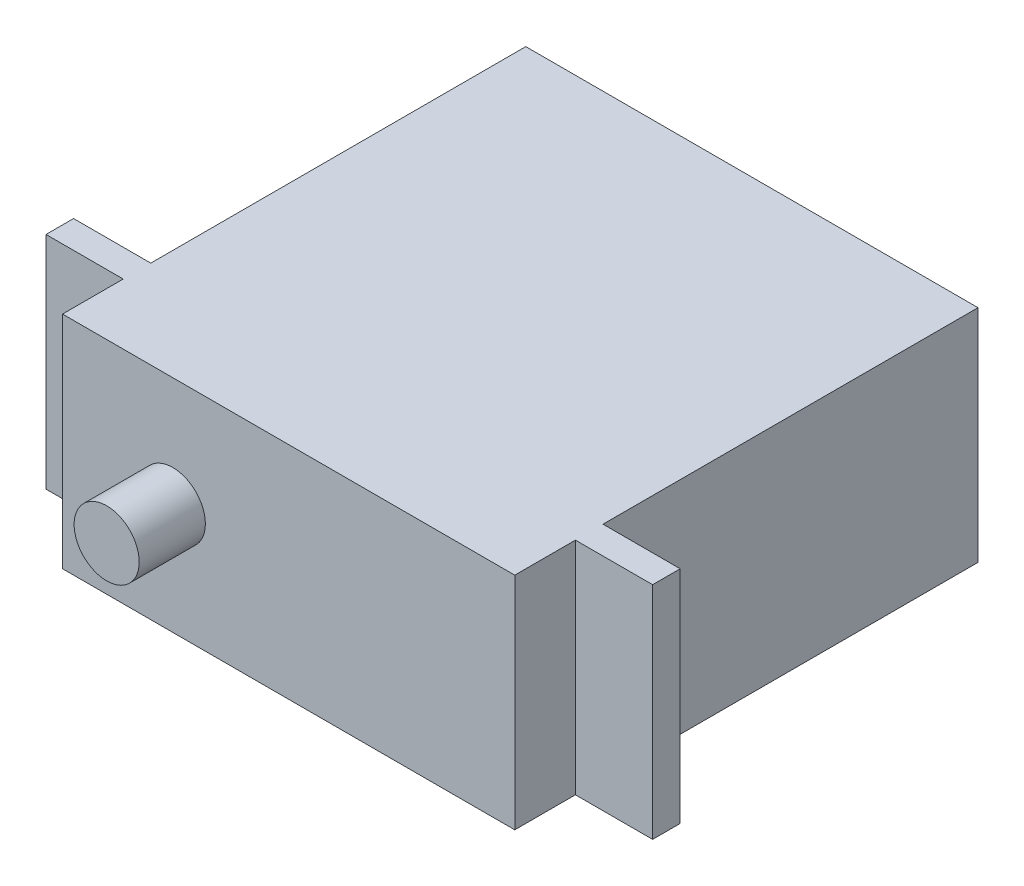
ISO-10303-21;
HEADER;
FILE_DESCRIPTION(('STEP AP214'),'2;1');
FILE_NAME('part.step','',(''),(''),'','','');
FILE_SCHEMA(('AUTOMOTIVE_DESIGN { 1 0 10303 214 1 1 1 1 }'));
ENDSEC;
DATA;
#1=APPLICATION_CONTEXT('core data for automotive mechanical design processes');
#2=APPLICATION_PROTOCOL_DEFINITION('international standard','automotive_design',2000,#1);
#3=PRODUCT_CONTEXT('',#1,'mechanical');
#4=PRODUCT('Part','Part','',(#3));
#5=PRODUCT_RELATED_PRODUCT_CATEGORY('part','',(#4));
#6=PRODUCT_DEFINITION_FORMATION('','',#4);
#7=PRODUCT_DEFINITION_CONTEXT('part definition',#1,'design');
#8=PRODUCT_DEFINITION('design','',#6,#7);
#9=PRODUCT_DEFINITION_SHAPE('','',#8);
#10=(LENGTH_UNIT() NAMED_UNIT(*) SI_UNIT(.MILLI.,.METRE.));
#11=(NAMED_UNIT(*) PLANE_ANGLE_UNIT() SI_UNIT($,.RADIAN.));
#12=(NAMED_UNIT(*) SI_UNIT($,.STERADIAN.) SOLID_ANGLE_UNIT());
#13=UNCERTAINTY_MEASURE_WITH_UNIT(LENGTH_MEASURE(1.E-05),#10,'distance_accuracy_value','');
#14=(GEOMETRIC_REPRESENTATION_CONTEXT(3) GLOBAL_UNCERTAINTY_ASSIGNED_CONTEXT((#13)) GLOBAL_UNIT_ASSIGNED_CONTEXT((#10,
#11,#12)) REPRESENTATION_CONTEXT('',''));
#15=CARTESIAN_POINT('',(0.,0.,0.));
#16=DIRECTION('',(0.,0.,1.));
#17=DIRECTION('',(1.,0.,0.));
#18=AXIS2_PLACEMENT_3D('',#15,#16,#17);
#19=CARTESIAN_POINT('',(-44.7515602948094,-3.43571428571428,42.));
#20=DIRECTION('',(1.,0.,0.));
#21=DIRECTION('',(0.,1.,0.));
#22=AXIS2_PLACEMENT_3D('',#19,#20,#21);
#23=PLANE('',#22);
#24=DIRECTION('',(0.,-1.,0.));
#25=VECTOR('',#24,1.);
#26=CARTESIAN_POINT('',(-44.7515602948094,-3.43571428571428,34.));
#27=LINE('',#26,#25);
#28=CARTESIAN_POINT('',(-44.7515602948094,-3.43571428571428,34.));
#29=VERTEX_POINT('',#28);
#30=CARTESIAN_POINT('',(-44.7515602948095,-23.4357142857143,34.));
#31=VERTEX_POINT('',#30);
#32=EDGE_CURVE('E47',#29,#31,#27,.T.);
#33=ORIENTED_EDGE('',*,*,#32,.F.);
#34=DIRECTION('',(0.,0.,-1.));
#35=VECTOR('',#34,1.);
#36=CARTESIAN_POINT('',(-44.7515602948094,-3.43571428571428,42.));
#37=LINE('',#36,#35);
#38=CARTESIAN_POINT('',(-44.7515602948094,-3.43571428571428,0.));
#39=VERTEX_POINT('',#38);
#40=EDGE_CURVE('E184',#29,#39,#37,.T.);
#41=ORIENTED_EDGE('',*,*,#40,.T.);
#42=DIRECTION('',(0.,-1.,0.));
#43=VECTOR('',#42,1.);
#44=CARTESIAN_POINT('',(-44.7515602948094,-3.43571428571428,0.));
#45=LINE('',#44,#43);
#46=CARTESIAN_POINT('',(-44.7515602948095,-23.4357142857143,0.));
#47=VERTEX_POINT('',#46);
#48=EDGE_CURVE('E173',#39,#47,#45,.T.);
#49=ORIENTED_EDGE('',*,*,#48,.T.);
#50=DIRECTION('',(0.,0.,-1.));
#51=VECTOR('',#50,1.);
#52=CARTESIAN_POINT('',(-44.7515602948095,-23.4357142857143,42.));
#53=LINE('',#52,#51);
#54=EDGE_CURVE('E40',#31,#47,#53,.T.);
#55=ORIENTED_EDGE('',*,*,#54,.F.);
#56=EDGE_LOOP('',(#33,#41,#49,#55));
#57=FACE_BOUND('',#56,.T.);
#58=ADVANCED_FACE('F33',(#57),#23,.F.);
#59=DIRECTION('',(0.,1.,0.));
#60=VECTOR('',#59,1.);
#61=CARTESIAN_POINT('',(-44.7515602948094,-3.43571428571428,36.5));
#62=LINE('',#61,#60);
#63=CARTESIAN_POINT('',(-44.7515602948095,-23.4357142857143,36.5));
#64=VERTEX_POINT('',#63);
#65=CARTESIAN_POINT('',(-44.7515602948094,-3.43571428571428,36.5));
#66=VERTEX_POINT('',#65);
#67=EDGE_CURVE('E138',#64,#66,#62,.T.);
#68=ORIENTED_EDGE('',*,*,#67,.F.);
#69=CARTESIAN_POINT('',(-44.7515602948095,-23.4357142857143,42.));
#70=VERTEX_POINT('',#69);
#71=EDGE_CURVE('E11',#70,#64,#53,.T.);
#72=ORIENTED_EDGE('',*,*,#71,.F.);
#73=DIRECTION('',(0.,-1.,0.));
#74=VECTOR('',#73,1.);
#75=CARTESIAN_POINT('',(-44.7515602948094,-3.43571428571428,42.));
#76=LINE('',#75,#74);
#77=CARTESIAN_POINT('',(-44.7515602948094,-3.43571428571428,42.));
#78=VERTEX_POINT('',#77);
#79=EDGE_CURVE('E174',#78,#70,#76,.T.);
#80=ORIENTED_EDGE('',*,*,#79,.F.);
#81=EDGE_CURVE('E193',#78,#66,#37,.T.);
#82=ORIENTED_EDGE('',*,*,#81,.T.);
#83=EDGE_LOOP('',(#68,#72,#80,#82));
#84=FACE_BOUND('',#83,.T.);
#85=ADVANCED_FACE('F269',(#84),#23,.F.);
#86=CARTESIAN_POINT('',(-3.75156029480944,-3.43571428571428,42.));
#87=DIRECTION('',(-1.,0.,0.));
#88=DIRECTION('',(0.,0.,1.));
#89=AXIS2_PLACEMENT_3D('',#86,#87,#88);
#90=PLANE('',#89);
#91=DIRECTION('',(0.,-1.,0.));
#92=VECTOR('',#91,1.);
#93=CARTESIAN_POINT('',(-3.75156029480944,-3.43571428571428,36.5));
#94=LINE('',#93,#92);
#95=CARTESIAN_POINT('',(-3.75156029480944,-3.43571428571428,36.5));
#96=VERTEX_POINT('',#95);
#97=CARTESIAN_POINT('',(-3.75156029480944,-23.4357142857143,36.5));
#98=VERTEX_POINT('',#97);
#99=EDGE_CURVE('E141',#96,#98,#94,.T.);
#100=ORIENTED_EDGE('',*,*,#99,.F.);
#101=DIRECTION('',(0.,0.,-1.));
#102=VECTOR('',#101,1.);
#103=CARTESIAN_POINT('',(-3.75156029480944,-3.43571428571428,42.));
#104=LINE('',#103,#102);
#105=CARTESIAN_POINT('',(-3.75156029480944,-3.43571428571428,42.));
#106=VERTEX_POINT('',#105);
#107=EDGE_CURVE('E196',#106,#96,#104,.T.);
#108=ORIENTED_EDGE('',*,*,#107,.F.);
#109=DIRECTION('',(0.,1.,0.));
#110=VECTOR('',#109,1.);
#111=CARTESIAN_POINT('',(-3.75156029480944,-3.43571428571428,42.));
#112=LINE('',#111,#110);
#113=CARTESIAN_POINT('',(-3.75156029480944,-23.4357142857143,42.));
#114=VERTEX_POINT('',#113);
#115=EDGE_CURVE('E180',#114,#106,#112,.T.);
#116=ORIENTED_EDGE('',*,*,#115,.F.);
#117=DIRECTION('',(0.,0.,-1.));
#118=VECTOR('',#117,1.);
#119=CARTESIAN_POINT('',(-3.75156029480944,-23.4357142857143,42.));
#120=LINE('',#119,#118);
#121=EDGE_CURVE('E199',#114,#98,#120,.T.);
#122=ORIENTED_EDGE('',*,*,#121,.T.);
#123=EDGE_LOOP('',(#100,#108,#116,#122));
#124=FACE_BOUND('',#123,.T.);
#125=ADVANCED_FACE('F228',(#124),#90,.F.);
#126=DIRECTION('',(0.,1.,0.));
#127=VECTOR('',#126,1.);
#128=CARTESIAN_POINT('',(-3.75156029480944,-3.43571428571428,34.));
#129=LINE('',#128,#127);
#130=CARTESIAN_POINT('',(-3.75156029480944,-23.4357142857143,34.));
#131=VERTEX_POINT('',#130);
#132=CARTESIAN_POINT('',(-3.75156029480944,-3.43571428571428,34.));
#133=VERTEX_POINT('',#132);
#134=EDGE_CURVE('E144',#131,#133,#129,.T.);
#135=ORIENTED_EDGE('',*,*,#134,.F.);
#136=CARTESIAN_POINT('',(-3.75156029480944,-23.4357142857143,0.));
#137=VERTEX_POINT('',#136);
#138=EDGE_CURVE('E198',#131,#137,#120,.T.);
#139=ORIENTED_EDGE('',*,*,#138,.T.);
#140=DIRECTION('',(0.,1.,0.));
#141=VECTOR('',#140,1.);
#142=CARTESIAN_POINT('',(-3.75156029480944,-3.43571428571428,0.));
#143=LINE('',#142,#141);
#144=CARTESIAN_POINT('',(-3.75156029480944,-3.43571428571428,0.));
#145=VERTEX_POINT('',#144);
#146=EDGE_CURVE('E188',#137,#145,#143,.T.);
#147=ORIENTED_EDGE('',*,*,#146,.T.);
#148=EDGE_CURVE('E195',#133,#145,#104,.T.);
#149=ORIENTED_EDGE('',*,*,#148,.F.);
#150=EDGE_LOOP('',(#135,#139,#147,#149));
#151=FACE_BOUND('',#150,.T.);
#152=ADVANCED_FACE('F205',(#151),#90,.F.);
#153=CARTESIAN_POINT('',(-44.7515602948095,-23.4357142857143,42.));
#154=DIRECTION('',(0.,1.,0.));
#155=DIRECTION('',(0.,0.,1.));
#156=AXIS2_PLACEMENT_3D('',#153,#154,#155);
#157=PLANE('',#156);
#158=DIRECTION('',(1.,0.,0.));
#159=VECTOR('',#158,1.);
#160=CARTESIAN_POINT('',(-44.7515602948095,-23.4357142857143,0.));
#161=LINE('',#160,#159);
#162=EDGE_CURVE('E186',#47,#137,#161,.T.);
#163=ORIENTED_EDGE('',*,*,#162,.T.);
#164=ORIENTED_EDGE('',*,*,#138,.F.);
#165=DIRECTION('',(-1.,0.,0.));
#166=VECTOR('',#165,1.);
#167=CARTESIAN_POINT('',(3.24843970519056,-23.4357142857143,34.));
#168=LINE('',#167,#166);
#169=CARTESIAN_POINT('',(3.24843970519056,-23.4357142857143,34.));
#170=VERTEX_POINT('',#169);
#171=EDGE_CURVE('E167',#170,#131,#168,.T.);
#172=ORIENTED_EDGE('',*,*,#171,.F.);
#173=DIRECTION('',(0.,0.,-1.));
#174=VECTOR('',#173,1.);
#175=CARTESIAN_POINT('',(3.24843970519056,-23.4357142857143,36.5));
#176=LINE('',#175,#174);
#177=CARTESIAN_POINT('',(3.24843970519056,-23.4357142857143,36.5));
#178=VERTEX_POINT('',#177);
#179=EDGE_CURVE('E153',#178,#170,#176,.T.);
#180=ORIENTED_EDGE('',*,*,#179,.F.);
#181=DIRECTION('',(-1.,0.,0.));
#182=VECTOR('',#181,1.);
#183=CARTESIAN_POINT('',(3.24843970519056,-23.4357142857143,36.5));
#184=LINE('',#183,#182);
#185=EDGE_CURVE('E170',#178,#98,#184,.T.);
#186=ORIENTED_EDGE('',*,*,#185,.T.);
#187=ORIENTED_EDGE('',*,*,#121,.F.);
#188=DIRECTION('',(1.,0.,0.));
#189=VECTOR('',#188,1.);
#190=CARTESIAN_POINT('',(-44.7515602948095,-23.4357142857143,42.));
#191=LINE('',#190,#189);
#192=EDGE_CURVE('E177',#70,#114,#191,.T.);
#193=ORIENTED_EDGE('',*,*,#192,.F.);
#194=ORIENTED_EDGE('',*,*,#71,.T.);
#195=DIRECTION('',(1.,0.,0.));
#196=VECTOR('',#195,1.);
#197=CARTESIAN_POINT('',(-51.7515602948095,-23.4357142857143,36.5));
#198=LINE('',#197,#196);
#199=CARTESIAN_POINT('',(-51.7515602948095,-23.4357142857143,36.5));
#200=VERTEX_POINT('',#199);
#201=EDGE_CURVE('E125',#200,#64,#198,.T.);
#202=ORIENTED_EDGE('',*,*,#201,.F.);
#203=DIRECTION('',(0.,0.,1.));
#204=VECTOR('',#203,1.);
#205=CARTESIAN_POINT('',(-51.7515602948095,-23.4357142857143,34.));
#206=LINE('',#205,#204);
#207=CARTESIAN_POINT('',(-51.7515602948095,-23.4357142857143,34.));
#208=VERTEX_POINT('',#207);
#209=EDGE_CURVE('E118',#208,#200,#206,.T.);
#210=ORIENTED_EDGE('',*,*,#209,.F.);
#211=DIRECTION('',(1.,0.,0.));
#212=VECTOR('',#211,1.);
#213=CARTESIAN_POINT('',(-51.7515602948095,-23.4357142857143,34.));
#214=LINE('',#213,#212);
#215=EDGE_CURVE('E123',#208,#31,#214,.T.);
#216=ORIENTED_EDGE('',*,*,#215,.T.);
#217=ORIENTED_EDGE('',*,*,#54,.T.);
#218=EDGE_LOOP('',(#163,#164,#172,#180,#186,#187,#193,#194,#202,#210,#216,#217));
#219=FACE_BOUND('',#218,.T.);
#220=ADVANCED_FACE('F121',(#219),#157,.F.);
#221=CARTESIAN_POINT('',(-44.7515602948094,-3.43571428571428,42.));
#222=DIRECTION('',(0.,-1.,0.));
#223=DIRECTION('',(0.,0.,-1.));
#224=AXIS2_PLACEMENT_3D('',#221,#222,#223);
#225=PLANE('',#224);
#226=DIRECTION('',(-1.,0.,0.));
#227=VECTOR('',#226,1.);
#228=CARTESIAN_POINT('',(-44.7515602948094,-3.43571428571428,0.));
#229=LINE('',#228,#227);
#230=EDGE_CURVE('E178',#145,#39,#229,.T.);
#231=ORIENTED_EDGE('',*,*,#230,.T.);
#232=ORIENTED_EDGE('',*,*,#40,.F.);
#233=DIRECTION('',(1.,0.,0.));
#234=VECTOR('',#233,1.);
#235=CARTESIAN_POINT('',(-51.7515602948094,-3.43571428571428,34.));
#236=LINE('',#235,#234);
#237=CARTESIAN_POINT('',(-51.7515602948094,-3.43571428571428,34.));
#238=VERTEX_POINT('',#237);
#239=EDGE_CURVE('E242',#238,#29,#236,.T.);
#240=ORIENTED_EDGE('',*,*,#239,.F.);
#241=DIRECTION('',(0.,0.,-1.));
#242=VECTOR('',#241,1.);
#243=CARTESIAN_POINT('',(-51.7515602948094,-3.43571428571428,34.));
#244=LINE('',#243,#242);
#245=CARTESIAN_POINT('',(-51.7515602948094,-3.43571428571428,36.5));
#246=VERTEX_POINT('',#245);
#247=EDGE_CURVE('E134',#246,#238,#244,.T.);
#248=ORIENTED_EDGE('',*,*,#247,.F.);
#249=DIRECTION('',(1.,0.,0.));
#250=VECTOR('',#249,1.);
#251=CARTESIAN_POINT('',(-51.7515602948094,-3.43571428571428,36.5));
#252=LINE('',#251,#250);
#253=EDGE_CURVE('E146',#246,#66,#252,.T.);
#254=ORIENTED_EDGE('',*,*,#253,.T.);
#255=ORIENTED_EDGE('',*,*,#81,.F.);
#256=DIRECTION('',(-1.,0.,0.));
#257=VECTOR('',#256,1.);
#258=CARTESIAN_POINT('',(-44.7515602948094,-3.43571428571428,42.));
#259=LINE('',#258,#257);
#260=EDGE_CURVE('E182',#106,#78,#259,.T.);
#261=ORIENTED_EDGE('',*,*,#260,.F.);
#262=ORIENTED_EDGE('',*,*,#107,.T.);
#263=DIRECTION('',(-1.,0.,0.));
#264=VECTOR('',#263,1.);
#265=CARTESIAN_POINT('',(3.24843970519056,-3.43571428571428,36.5));
#266=LINE('',#265,#264);
#267=CARTESIAN_POINT('',(3.24843970519056,-3.43571428571428,36.5));
#268=VERTEX_POINT('',#267);
#269=EDGE_CURVE('E158',#268,#96,#266,.T.);
#270=ORIENTED_EDGE('',*,*,#269,.F.);
#271=DIRECTION('',(0.,0.,1.));
#272=VECTOR('',#271,1.);
#273=CARTESIAN_POINT('',(3.24843970519056,-3.43571428571428,36.5));
#274=LINE('',#273,#272);
#275=CARTESIAN_POINT('',(3.24843970519056,-3.43571428571428,34.));
#276=VERTEX_POINT('',#275);
#277=EDGE_CURVE('E157',#276,#268,#274,.T.);
#278=ORIENTED_EDGE('',*,*,#277,.F.);
#279=DIRECTION('',(-1.,0.,0.));
#280=VECTOR('',#279,1.);
#281=CARTESIAN_POINT('',(3.24843970519056,-3.43571428571428,34.));
#282=LINE('',#281,#280);
#283=EDGE_CURVE('E164',#276,#133,#282,.T.);
#284=ORIENTED_EDGE('',*,*,#283,.T.);
#285=ORIENTED_EDGE('',*,*,#148,.T.);
#286=EDGE_LOOP('',(#231,#232,#240,#248,#254,#255,#261,#262,#270,#278,#284,#285));
#287=FACE_BOUND('',#286,.T.);
#288=ADVANCED_FACE('F214',(#287),#225,.F.);
#289=CARTESIAN_POINT('',(0.,0.,42.));
#290=DIRECTION('',(0.,0.,1.));
#291=DIRECTION('',(1.,0.,0.));
#292=AXIS2_PLACEMENT_3D('',#289,#290,#291);
#293=PLANE('',#292);
#294=CARTESIAN_POINT('',(-34.7515602948094,-13.4357142857143,42.));
#295=DIRECTION('',(0.,0.,1.));
#296=DIRECTION('',(1.,0.,0.));
#297=AXIS2_PLACEMENT_3D('',#294,#295,#296);
#298=CIRCLE('',#297,2.95);
#299=CARTESIAN_POINT('',(-31.8015602948094,-13.4357142857143,42.));
#300=VERTEX_POINT('',#299);
#301=EDGE_CURVE('E249',#300,#300,#298,.T.);
#302=ORIENTED_EDGE('',*,*,#301,.F.);
#303=EDGE_LOOP('',(#302));
#304=FACE_BOUND('',#303,.T.);
#305=ORIENTED_EDGE('',*,*,#79,.T.);
#306=ORIENTED_EDGE('',*,*,#192,.T.);
#307=ORIENTED_EDGE('',*,*,#115,.T.);
#308=ORIENTED_EDGE('',*,*,#260,.T.);
#309=EDGE_LOOP('',(#305,#306,#307,#308));
#310=FACE_BOUND('',#309,.T.);
#311=ADVANCED_FACE('F234',(#304,#310),#293,.T.);
#312=CARTESIAN_POINT('',(0.,0.,0.));
#313=DIRECTION('',(0.,0.,1.));
#314=DIRECTION('',(1.,0.,0.));
#315=AXIS2_PLACEMENT_3D('',#312,#313,#314);
#316=PLANE('',#315);
#317=ORIENTED_EDGE('',*,*,#48,.F.);
#318=ORIENTED_EDGE('',*,*,#230,.F.);
#319=ORIENTED_EDGE('',*,*,#146,.F.);
#320=ORIENTED_EDGE('',*,*,#162,.F.);
#321=EDGE_LOOP('',(#317,#318,#319,#320));
#322=FACE_BOUND('',#321,.T.);
#323=ADVANCED_FACE('F212',(#322),#316,.F.);
#324=CARTESIAN_POINT('',(3.24843970519056,-3.43571428571428,36.5));
#325=DIRECTION('',(0.,0.,-1.));
#326=DIRECTION('',(-1.,0.,0.));
#327=AXIS2_PLACEMENT_3D('',#324,#325,#326);
#328=PLANE('',#327);
#329=ORIENTED_EDGE('',*,*,#99,.T.);
#330=ORIENTED_EDGE('',*,*,#185,.F.);
#331=DIRECTION('',(0.,-1.,0.));
#332=VECTOR('',#331,1.);
#333=CARTESIAN_POINT('',(3.24843970519056,-3.43571428571428,36.5));
#334=LINE('',#333,#332);
#335=EDGE_CURVE('E150',#268,#178,#334,.T.);
#336=ORIENTED_EDGE('',*,*,#335,.F.);
#337=ORIENTED_EDGE('',*,*,#269,.T.);
#338=EDGE_LOOP('',(#329,#330,#336,#337));
#339=FACE_BOUND('',#338,.T.);
#340=ADVANCED_FACE('F226',(#339),#328,.F.);
#341=CARTESIAN_POINT('',(3.24843970519056,-3.43571428571428,34.));
#342=DIRECTION('',(0.,0.,1.));
#343=DIRECTION('',(1.,0.,0.));
#344=AXIS2_PLACEMENT_3D('',#341,#342,#343);
#345=PLANE('',#344);
#346=ORIENTED_EDGE('',*,*,#134,.T.);
#347=ORIENTED_EDGE('',*,*,#283,.F.);
#348=DIRECTION('',(0.,1.,0.));
#349=VECTOR('',#348,1.);
#350=CARTESIAN_POINT('',(3.24843970519056,-3.43571428571428,34.));
#351=LINE('',#350,#349);
#352=EDGE_CURVE('E155',#170,#276,#351,.T.);
#353=ORIENTED_EDGE('',*,*,#352,.F.);
#354=ORIENTED_EDGE('',*,*,#171,.T.);
#355=EDGE_LOOP('',(#346,#347,#353,#354));
#356=FACE_BOUND('',#355,.T.);
#357=ADVANCED_FACE('F218',(#356),#345,.F.);
#358=CARTESIAN_POINT('',(3.24843970519056,0.,0.));
#359=DIRECTION('',(1.,0.,0.));
#360=DIRECTION('',(0.,0.,-1.));
#361=AXIS2_PLACEMENT_3D('',#358,#359,#360);
#362=PLANE('',#361);
#363=ORIENTED_EDGE('',*,*,#335,.T.);
#364=ORIENTED_EDGE('',*,*,#179,.T.);
#365=ORIENTED_EDGE('',*,*,#352,.T.);
#366=ORIENTED_EDGE('',*,*,#277,.T.);
#367=EDGE_LOOP('',(#363,#364,#365,#366));
#368=FACE_BOUND('',#367,.T.);
#369=ADVANCED_FACE('F223',(#368),#362,.T.);
#370=CARTESIAN_POINT('',(-51.7515602948094,-3.43571428571428,34.));
#371=DIRECTION('',(0.,0.,1.));
#372=DIRECTION('',(1.,0.,0.));
#373=AXIS2_PLACEMENT_3D('',#370,#371,#372);
#374=PLANE('',#373);
#375=ORIENTED_EDGE('',*,*,#32,.T.);
#376=ORIENTED_EDGE('',*,*,#215,.F.);
#377=DIRECTION('',(0.,-1.,0.));
#378=VECTOR('',#377,1.);
#379=CARTESIAN_POINT('',(-51.7515602948094,-3.43571428571428,34.));
#380=LINE('',#379,#378);
#381=EDGE_CURVE('E129',#238,#208,#380,.T.);
#382=ORIENTED_EDGE('',*,*,#381,.F.);
#383=ORIENTED_EDGE('',*,*,#239,.T.);
#384=EDGE_LOOP('',(#375,#376,#382,#383));
#385=FACE_BOUND('',#384,.T.);
#386=ADVANCED_FACE('F140',(#385),#374,.F.);
#387=CARTESIAN_POINT('',(-51.7515602948094,-3.43571428571428,36.5));
#388=DIRECTION('',(0.,0.,-1.));
#389=DIRECTION('',(-1.,0.,0.));
#390=AXIS2_PLACEMENT_3D('',#387,#388,#389);
#391=PLANE('',#390);
#392=ORIENTED_EDGE('',*,*,#67,.T.);
#393=ORIENTED_EDGE('',*,*,#253,.F.);
#394=DIRECTION('',(0.,1.,0.));
#395=VECTOR('',#394,1.);
#396=CARTESIAN_POINT('',(-51.7515602948094,-3.43571428571428,36.5));
#397=LINE('',#396,#395);
#398=EDGE_CURVE('E128',#200,#246,#397,.T.);
#399=ORIENTED_EDGE('',*,*,#398,.F.);
#400=ORIENTED_EDGE('',*,*,#201,.T.);
#401=EDGE_LOOP('',(#392,#393,#399,#400));
#402=FACE_BOUND('',#401,.T.);
#403=ADVANCED_FACE('F239',(#402),#391,.F.);
#404=CARTESIAN_POINT('',(-51.7515602948094,0.,0.));
#405=DIRECTION('',(-1.,0.,0.));
#406=DIRECTION('',(0.,-1.,0.));
#407=AXIS2_PLACEMENT_3D('',#404,#405,#406);
#408=PLANE('',#407);
#409=ORIENTED_EDGE('',*,*,#381,.T.);
#410=ORIENTED_EDGE('',*,*,#209,.T.);
#411=ORIENTED_EDGE('',*,*,#398,.T.);
#412=ORIENTED_EDGE('',*,*,#247,.T.);
#413=EDGE_LOOP('',(#409,#410,#411,#412));
#414=FACE_BOUND('',#413,.T.);
#415=ADVANCED_FACE('F132',(#414),#408,.T.);
#416=CARTESIAN_POINT('',(-34.7515602948094,-13.4357142857143,48.));
#417=DIRECTION('',(0.,0.,-1.));
#418=DIRECTION('',(-1.,0.,0.));
#419=AXIS2_PLACEMENT_3D('',#416,#417,#418);
#420=CYLINDRICAL_SURFACE('',#419,2.95);
#421=CARTESIAN_POINT('',(-34.7515602948094,-13.4357142857143,48.));
#422=DIRECTION('',(0.,0.,1.));
#423=DIRECTION('',(1.,0.,0.));
#424=AXIS2_PLACEMENT_3D('',#421,#422,#423);
#425=CIRCLE('',#424,2.95);
#426=CARTESIAN_POINT('',(-31.8015602948094,-13.4357142857143,48.));
#427=VERTEX_POINT('',#426);
#428=EDGE_CURVE('E246',#427,#427,#425,.T.);
#429=ORIENTED_EDGE('',*,*,#428,.F.);
#430=EDGE_LOOP('',(#429));
#431=FACE_BOUND('',#430,.T.);
#432=ORIENTED_EDGE('',*,*,#301,.T.);
#433=EDGE_LOOP('',(#432));
#434=FACE_BOUND('',#433,.T.);
#435=ADVANCED_FACE('F257',(#431,#434),#420,.T.);
#436=CARTESIAN_POINT('',(-34.7515602948094,-13.4357142857143,48.));
#437=DIRECTION('',(0.,0.,1.));
#438=DIRECTION('',(1.,0.,0.));
#439=AXIS2_PLACEMENT_3D('',#436,#437,#438);
#440=PLANE('',#439);
#441=ORIENTED_EDGE('',*,*,#428,.T.);
#442=EDGE_LOOP('',(#441));
#443=FACE_BOUND('',#442,.T.);
#444=ADVANCED_FACE('F330',(#443),#440,.T.);
#445=CLOSED_SHELL('',(#58,#85,#125,#152,#220,#288,#311,#323,#340,#357,#369,#386,#403,#415,#435,#444));
#446=MANIFOLD_SOLID_BREP('B2',#445);
#447=ADVANCED_BREP_SHAPE_REPRESENTATION('',(#18,#446),#14);
#448=SHAPE_DEFINITION_REPRESENTATION(#9,#447);
ENDSEC;
END-ISO-10303-21;
